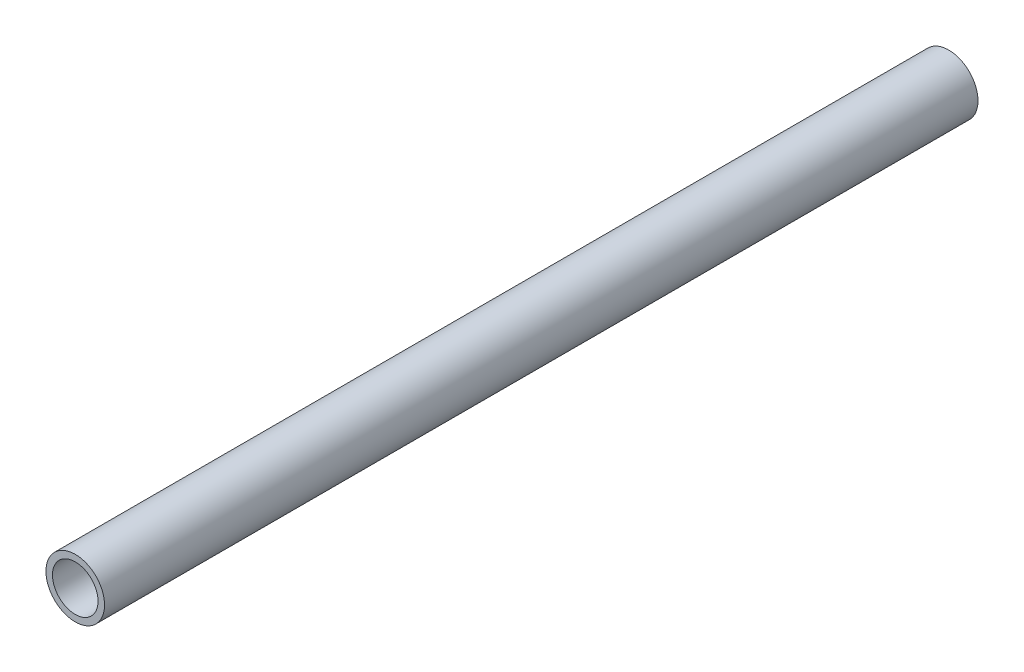
ISO-10303-21;
HEADER;
FILE_DESCRIPTION(('STEP AP214'),'2;1');
FILE_NAME('part.step','',(''),(''),'','','');
FILE_SCHEMA(('AUTOMOTIVE_DESIGN { 1 0 10303 214 1 1 1 1 }'));
ENDSEC;
DATA;
#1=APPLICATION_CONTEXT('core data for automotive mechanical design processes');
#2=APPLICATION_PROTOCOL_DEFINITION('international standard','automotive_design',2000,#1);
#3=PRODUCT_CONTEXT('',#1,'mechanical');
#4=PRODUCT('Part','Part','',(#3));
#5=PRODUCT_RELATED_PRODUCT_CATEGORY('part','',(#4));
#6=PRODUCT_DEFINITION_FORMATION('','',#4);
#7=PRODUCT_DEFINITION_CONTEXT('part definition',#1,'design');
#8=PRODUCT_DEFINITION('design','',#6,#7);
#9=PRODUCT_DEFINITION_SHAPE('','',#8);
#10=(LENGTH_UNIT() NAMED_UNIT(*) SI_UNIT(.MILLI.,.METRE.));
#11=(NAMED_UNIT(*) PLANE_ANGLE_UNIT() SI_UNIT($,.RADIAN.));
#12=(NAMED_UNIT(*) SI_UNIT($,.STERADIAN.) SOLID_ANGLE_UNIT());
#13=UNCERTAINTY_MEASURE_WITH_UNIT(LENGTH_MEASURE(1.E-05),#10,'distance_accuracy_value','');
#14=(GEOMETRIC_REPRESENTATION_CONTEXT(3) GLOBAL_UNCERTAINTY_ASSIGNED_CONTEXT((#13)) GLOBAL_UNIT_ASSIGNED_CONTEXT((#10,
#11,#12)) REPRESENTATION_CONTEXT('',''));
#15=CARTESIAN_POINT('',(0.,0.,0.));
#16=DIRECTION('',(0.,0.,1.));
#17=DIRECTION('',(1.,0.,0.));
#18=AXIS2_PLACEMENT_3D('',#15,#16,#17);
#19=CARTESIAN_POINT('',(0.,0.,805.));
#20=DIRECTION('',(0.,0.,1.));
#21=DIRECTION('',(1.,0.,0.));
#22=AXIS2_PLACEMENT_3D('',#19,#20,#21);
#23=PLANE('',#22);
#24=CARTESIAN_POINT('',(0.,0.,805.));
#25=DIRECTION('',(0.,0.,1.));
#26=DIRECTION('',(1.,0.,0.));
#27=AXIS2_PLACEMENT_3D('',#24,#25,#26);
#28=CIRCLE('',#27,54.);
#29=CARTESIAN_POINT('',(54.,0.,805.));
#30=VERTEX_POINT('',#29);
#31=EDGE_CURVE('E10',#30,#30,#28,.T.);
#32=ORIENTED_EDGE('',*,*,#31,.T.);
#33=EDGE_LOOP('',(#32));
#34=FACE_BOUND('',#33,.T.);
#35=CARTESIAN_POINT('',(0.,0.,805.));
#36=DIRECTION('',(0.,0.,1.));
#37=DIRECTION('',(1.,0.,0.));
#38=AXIS2_PLACEMENT_3D('',#35,#36,#37);
#39=CIRCLE('',#38,42.);
#40=CARTESIAN_POINT('',(42.,0.,805.));
#41=VERTEX_POINT('',#40);
#42=EDGE_CURVE('E51',#41,#41,#39,.T.);
#43=ORIENTED_EDGE('',*,*,#42,.F.);
#44=EDGE_LOOP('',(#43));
#45=FACE_BOUND('',#44,.T.);
#46=ADVANCED_FACE('F38',(#34,#45),#23,.T.);
#47=CARTESIAN_POINT('',(0.,0.,-805.));
#48=DIRECTION('',(0.,0.,1.));
#49=DIRECTION('',(1.,0.,0.));
#50=AXIS2_PLACEMENT_3D('',#47,#48,#49);
#51=PLANE('',#50);
#52=CARTESIAN_POINT('',(0.,0.,-805.));
#53=DIRECTION('',(0.,0.,1.));
#54=DIRECTION('',(1.,0.,0.));
#55=AXIS2_PLACEMENT_3D('',#52,#53,#54);
#56=CIRCLE('',#55,54.);
#57=CARTESIAN_POINT('',(54.,0.,-805.));
#58=VERTEX_POINT('',#57);
#59=EDGE_CURVE('E42',#58,#58,#56,.T.);
#60=ORIENTED_EDGE('',*,*,#59,.F.);
#61=EDGE_LOOP('',(#60));
#62=FACE_BOUND('',#61,.T.);
#63=CARTESIAN_POINT('',(0.,0.,-805.));
#64=DIRECTION('',(0.,0.,1.));
#65=DIRECTION('',(1.,0.,0.));
#66=AXIS2_PLACEMENT_3D('',#63,#64,#65);
#67=CIRCLE('',#66,42.);
#68=CARTESIAN_POINT('',(42.,0.,-805.));
#69=VERTEX_POINT('',#68);
#70=EDGE_CURVE('E53',#69,#69,#67,.T.);
#71=ORIENTED_EDGE('',*,*,#70,.T.);
#72=EDGE_LOOP('',(#71));
#73=FACE_BOUND('',#72,.T.);
#74=ADVANCED_FACE('F63',(#62,#73),#51,.F.);
#75=CARTESIAN_POINT('',(0.,0.,805.));
#76=DIRECTION('',(0.,0.,-1.));
#77=DIRECTION('',(-1.,0.,0.));
#78=AXIS2_PLACEMENT_3D('',#75,#76,#77);
#79=CYLINDRICAL_SURFACE('',#78,54.);
#80=ORIENTED_EDGE('',*,*,#31,.F.);
#81=EDGE_LOOP('',(#80));
#82=FACE_BOUND('',#81,.T.);
#83=ORIENTED_EDGE('',*,*,#59,.T.);
#84=EDGE_LOOP('',(#83));
#85=FACE_BOUND('',#84,.T.);
#86=ADVANCED_FACE('F40',(#82,#85),#79,.T.);
#87=CARTESIAN_POINT('',(0.,0.,805.));
#88=DIRECTION('',(0.,0.,-1.));
#89=DIRECTION('',(-1.,0.,0.));
#90=AXIS2_PLACEMENT_3D('',#87,#88,#89);
#91=CYLINDRICAL_SURFACE('',#90,42.);
#92=ORIENTED_EDGE('',*,*,#42,.T.);
#93=EDGE_LOOP('',(#92));
#94=FACE_BOUND('',#93,.T.);
#95=ORIENTED_EDGE('',*,*,#70,.F.);
#96=EDGE_LOOP('',(#95));
#97=FACE_BOUND('',#96,.T.);
#98=ADVANCED_FACE('F59',(#94,#97),#91,.F.);
#99=CLOSED_SHELL('',(#46,#74,#86,#98));
#100=MANIFOLD_SOLID_BREP('B2',#99);
#101=ADVANCED_BREP_SHAPE_REPRESENTATION('',(#18,#100),#14);
#102=SHAPE_DEFINITION_REPRESENTATION(#9,#101);
ENDSEC;
END-ISO-10303-21;
